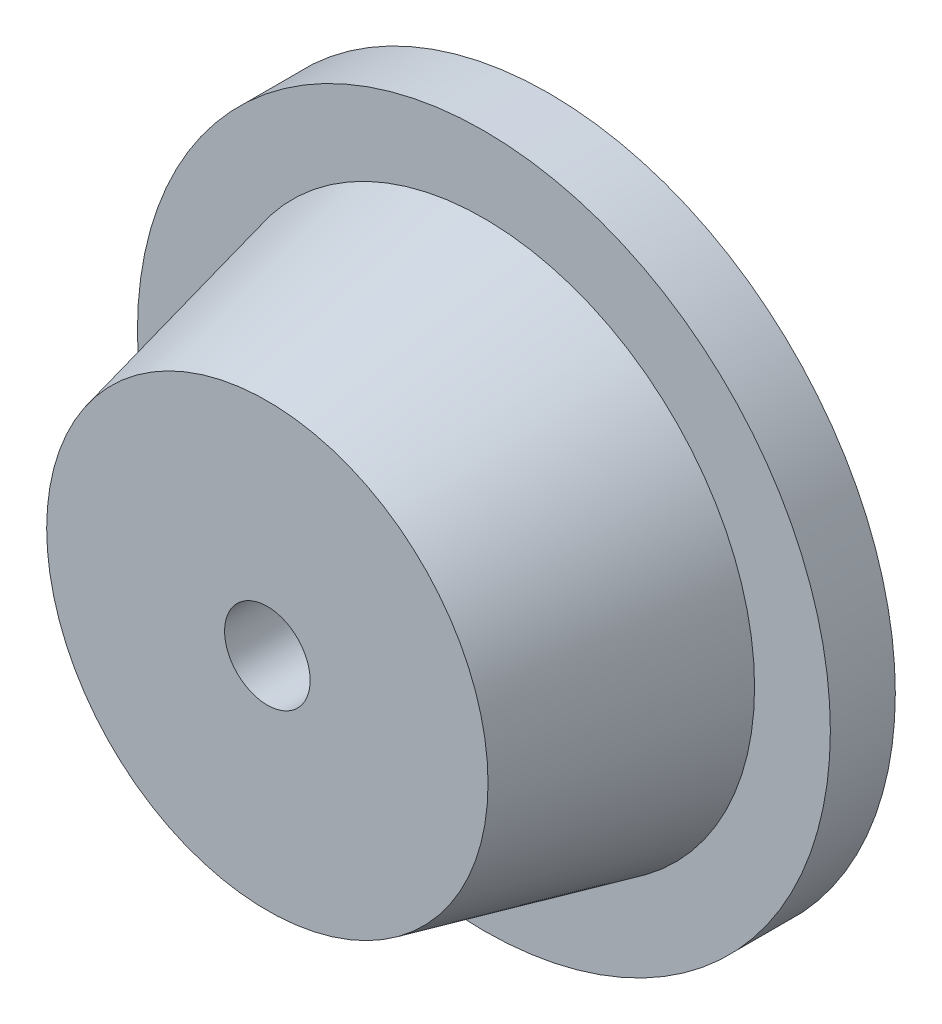
ISO-10303-21;
HEADER;
FILE_DESCRIPTION(('STEP AP214'),'2;1');
FILE_NAME('part.step','',(''),(''),'','','');
FILE_SCHEMA(('AUTOMOTIVE_DESIGN { 1 0 10303 214 1 1 1 1 }'));
ENDSEC;
DATA;
#1=APPLICATION_CONTEXT('core data for automotive mechanical design processes');
#2=APPLICATION_PROTOCOL_DEFINITION('international standard','automotive_design',2000,#1);
#3=PRODUCT_CONTEXT('',#1,'mechanical');
#4=PRODUCT('Part','Part','',(#3));
#5=PRODUCT_RELATED_PRODUCT_CATEGORY('part','',(#4));
#6=PRODUCT_DEFINITION_FORMATION('','',#4);
#7=PRODUCT_DEFINITION_CONTEXT('part definition',#1,'design');
#8=PRODUCT_DEFINITION('design','',#6,#7);
#9=PRODUCT_DEFINITION_SHAPE('','',#8);
#10=(LENGTH_UNIT() NAMED_UNIT(*) SI_UNIT(.MILLI.,.METRE.));
#11=(NAMED_UNIT(*) PLANE_ANGLE_UNIT() SI_UNIT($,.RADIAN.));
#12=(NAMED_UNIT(*) SI_UNIT($,.STERADIAN.) SOLID_ANGLE_UNIT());
#13=UNCERTAINTY_MEASURE_WITH_UNIT(LENGTH_MEASURE(1.E-05),#10,'distance_accuracy_value','');
#14=(GEOMETRIC_REPRESENTATION_CONTEXT(3) GLOBAL_UNCERTAINTY_ASSIGNED_CONTEXT((#13)) GLOBAL_UNIT_ASSIGNED_CONTEXT((#10,
#11,#12)) REPRESENTATION_CONTEXT('',''));
#15=CARTESIAN_POINT('',(0.,0.,0.));
#16=DIRECTION('',(0.,0.,1.));
#17=DIRECTION('',(1.,0.,0.));
#18=AXIS2_PLACEMENT_3D('',#15,#16,#17);
#19=CARTESIAN_POINT('',(0.,0.,3.));
#20=DIRECTION('',(0.,0.,-1.));
#21=DIRECTION('',(-1.,0.,0.));
#22=AXIS2_PLACEMENT_3D('',#19,#20,#21);
#23=CYLINDRICAL_SURFACE('',#22,16.);
#24=CARTESIAN_POINT('',(0.,0.,3.));
#25=DIRECTION('',(0.,0.,1.));
#26=DIRECTION('',(1.,0.,0.));
#27=AXIS2_PLACEMENT_3D('',#24,#25,#26);
#28=CIRCLE('',#27,16.);
#29=CARTESIAN_POINT('',(16.,0.,3.));
#30=VERTEX_POINT('',#29);
#31=EDGE_CURVE('E46',#30,#30,#28,.T.);
#32=ORIENTED_EDGE('',*,*,#31,.F.);
#33=EDGE_LOOP('',(#32));
#34=FACE_BOUND('',#33,.T.);
#35=CARTESIAN_POINT('',(0.,0.,0.));
#36=DIRECTION('',(0.,0.,1.));
#37=DIRECTION('',(1.,0.,0.));
#38=AXIS2_PLACEMENT_3D('',#35,#36,#37);
#39=CIRCLE('',#38,16.);
#40=CARTESIAN_POINT('',(16.,0.,0.));
#41=VERTEX_POINT('',#40);
#42=EDGE_CURVE('E42',#41,#41,#39,.T.);
#43=ORIENTED_EDGE('',*,*,#42,.T.);
#44=EDGE_LOOP('',(#43));
#45=FACE_BOUND('',#44,.T.);
#46=ADVANCED_FACE('F39',(#34,#45),#23,.T.);
#47=CARTESIAN_POINT('',(0.,0.,3.));
#48=DIRECTION('',(0.,0.,1.));
#49=DIRECTION('',(1.,0.,0.));
#50=AXIS2_PLACEMENT_3D('',#47,#48,#49);
#51=PLANE('',#50);
#52=CARTESIAN_POINT('',(0.,0.,3.));
#53=DIRECTION('',(0.,0.,1.));
#54=DIRECTION('',(1.,0.,0.));
#55=AXIS2_PLACEMENT_3D('',#52,#53,#54);
#56=CIRCLE('',#55,12.5);
#57=CARTESIAN_POINT('',(12.5,0.,3.));
#58=VERTEX_POINT('',#57);
#59=EDGE_CURVE('E10',#58,#58,#56,.T.);
#60=ORIENTED_EDGE('',*,*,#59,.F.);
#61=EDGE_LOOP('',(#60));
#62=FACE_BOUND('',#61,.T.);
#63=ORIENTED_EDGE('',*,*,#31,.T.);
#64=EDGE_LOOP('',(#63));
#65=FACE_BOUND('',#64,.T.);
#66=ADVANCED_FACE('F84',(#62,#65),#51,.T.);
#67=CARTESIAN_POINT('',(0.,0.,0.));
#68=DIRECTION('',(0.,0.,1.));
#69=DIRECTION('',(1.,0.,0.));
#70=AXIS2_PLACEMENT_3D('',#67,#68,#69);
#71=PLANE('',#70);
#72=CARTESIAN_POINT('',(0.,0.,0.));
#73=DIRECTION('',(0.,0.,1.));
#74=DIRECTION('',(1.,0.,0.));
#75=AXIS2_PLACEMENT_3D('',#72,#73,#74);
#76=CIRCLE('',#75,1.975);
#77=CARTESIAN_POINT('',(1.975,0.,0.));
#78=VERTEX_POINT('',#77);
#79=EDGE_CURVE('E57',#78,#78,#76,.T.);
#80=ORIENTED_EDGE('',*,*,#79,.T.);
#81=EDGE_LOOP('',(#80));
#82=FACE_BOUND('',#81,.T.);
#83=ORIENTED_EDGE('',*,*,#42,.F.);
#84=EDGE_LOOP('',(#83));
#85=FACE_BOUND('',#84,.T.);
#86=ADVANCED_FACE('F80',(#82,#85),#71,.F.);
#87=CARTESIAN_POINT('',(0.,0.,3.));
#88=DIRECTION('',(0.,0.,-1.));
#89=DIRECTION('',(1.,0.,0.));
#90=AXIS2_PLACEMENT_3D('',#87,#88,#89);
#91=CONICAL_SURFACE('',#90,12.5,0.226892802759263);
#92=CARTESIAN_POINT('',(0.,0.,13.));
#93=DIRECTION('',(0.,0.,1.));
#94=DIRECTION('',(1.,0.,0.));
#95=AXIS2_PLACEMENT_3D('',#92,#93,#94);
#96=CIRCLE('',#95,10.1913180887444);
#97=CARTESIAN_POINT('',(10.1913180887444,0.,13.));
#98=VERTEX_POINT('',#97);
#99=EDGE_CURVE('E55',#98,#98,#96,.T.);
#100=ORIENTED_EDGE('',*,*,#99,.F.);
#101=EDGE_LOOP('',(#100));
#102=FACE_BOUND('',#101,.T.);
#103=ORIENTED_EDGE('',*,*,#59,.T.);
#104=EDGE_LOOP('',(#103));
#105=FACE_BOUND('',#104,.T.);
#106=ADVANCED_FACE('F71',(#102,#105),#91,.T.);
#107=CARTESIAN_POINT('',(0.,0.,13.));
#108=DIRECTION('',(0.,0.,1.));
#109=DIRECTION('',(1.,0.,0.));
#110=AXIS2_PLACEMENT_3D('',#107,#108,#109);
#111=PLANE('',#110);
#112=CARTESIAN_POINT('',(0.,0.,13.));
#113=DIRECTION('',(0.,0.,1.));
#114=DIRECTION('',(1.,0.,0.));
#115=AXIS2_PLACEMENT_3D('',#112,#113,#114);
#116=CIRCLE('',#115,1.975);
#117=CARTESIAN_POINT('',(1.975,0.,13.));
#118=VERTEX_POINT('',#117);
#119=EDGE_CURVE('E53',#118,#118,#116,.T.);
#120=ORIENTED_EDGE('',*,*,#119,.F.);
#121=EDGE_LOOP('',(#120));
#122=FACE_BOUND('',#121,.T.);
#123=ORIENTED_EDGE('',*,*,#99,.T.);
#124=EDGE_LOOP('',(#123));
#125=FACE_BOUND('',#124,.T.);
#126=ADVANCED_FACE('F69',(#122,#125),#111,.T.);
#127=CARTESIAN_POINT('',(0.,0.,0.));
#128=DIRECTION('',(0.,0.,1.));
#129=DIRECTION('',(1.,0.,0.));
#130=AXIS2_PLACEMENT_3D('',#127,#128,#129);
#131=CYLINDRICAL_SURFACE('',#130,1.975);
#132=ORIENTED_EDGE('',*,*,#79,.F.);
#133=EDGE_LOOP('',(#132));
#134=FACE_BOUND('',#133,.T.);
#135=ORIENTED_EDGE('',*,*,#119,.T.);
#136=EDGE_LOOP('',(#135));
#137=FACE_BOUND('',#136,.T.);
#138=ADVANCED_FACE('F67',(#134,#137),#131,.F.);
#139=CLOSED_SHELL('',(#46,#66,#86,#106,#126,#138));
#140=MANIFOLD_SOLID_BREP('B2',#139);
#141=ADVANCED_BREP_SHAPE_REPRESENTATION('',(#18,#140),#14);
#142=SHAPE_DEFINITION_REPRESENTATION(#9,#141);
ENDSEC;
END-ISO-10303-21;
